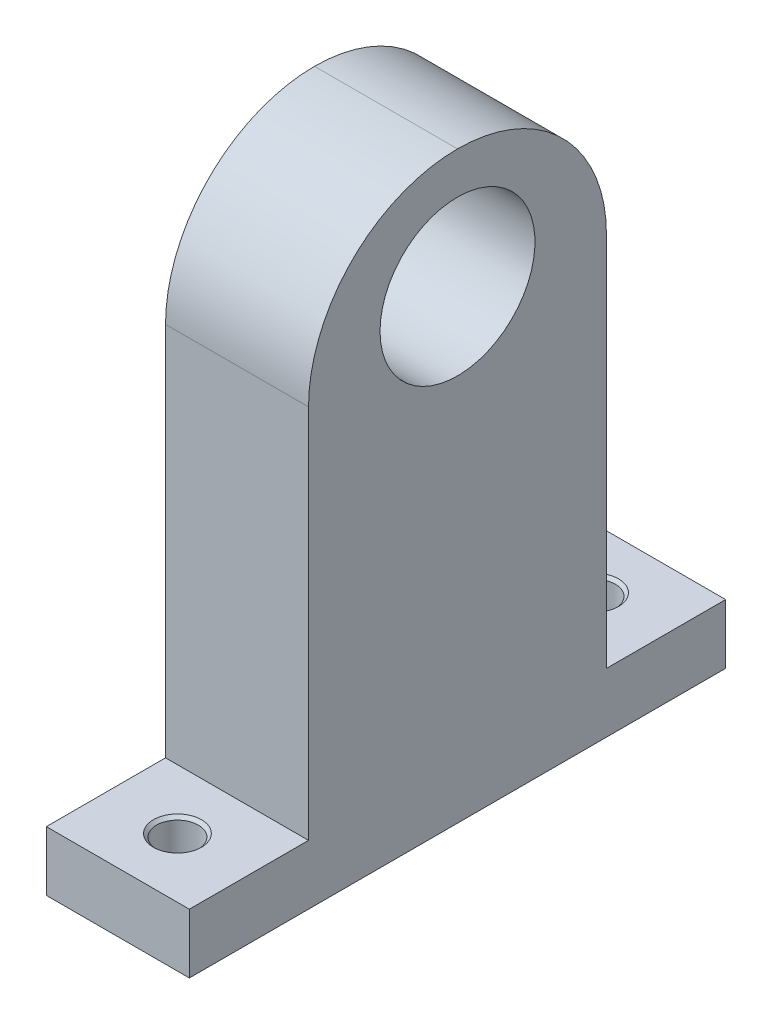
ISO-10303-21;
HEADER;
FILE_DESCRIPTION(('STEP AP214'),'2;1');
FILE_NAME('part.step','',(''),(''),'','','');
FILE_SCHEMA(('AUTOMOTIVE_DESIGN { 1 0 10303 214 1 1 1 1 }'));
ENDSEC;
DATA;
#1=APPLICATION_CONTEXT('core data for automotive mechanical design processes');
#2=APPLICATION_PROTOCOL_DEFINITION('international standard','automotive_design',2000,#1);
#3=PRODUCT_CONTEXT('',#1,'mechanical');
#4=PRODUCT('Part','Part','',(#3));
#5=PRODUCT_RELATED_PRODUCT_CATEGORY('part','',(#4));
#6=PRODUCT_DEFINITION_FORMATION('','',#4);
#7=PRODUCT_DEFINITION_CONTEXT('part definition',#1,'design');
#8=PRODUCT_DEFINITION('design','',#6,#7);
#9=PRODUCT_DEFINITION_SHAPE('','',#8);
#10=(LENGTH_UNIT() NAMED_UNIT(*) SI_UNIT(.MILLI.,.METRE.));
#11=(NAMED_UNIT(*) PLANE_ANGLE_UNIT() SI_UNIT($,.RADIAN.));
#12=(NAMED_UNIT(*) SI_UNIT($,.STERADIAN.) SOLID_ANGLE_UNIT());
#13=UNCERTAINTY_MEASURE_WITH_UNIT(LENGTH_MEASURE(1.E-05),#10,'distance_accuracy_value','');
#14=(GEOMETRIC_REPRESENTATION_CONTEXT(3) GLOBAL_UNCERTAINTY_ASSIGNED_CONTEXT((#13)) GLOBAL_UNIT_ASSIGNED_CONTEXT((#10,
#11,#12)) REPRESENTATION_CONTEXT('',''));
#15=CARTESIAN_POINT('',(0.,0.,0.));
#16=DIRECTION('',(0.,0.,1.));
#17=DIRECTION('',(1.,0.,0.));
#18=AXIS2_PLACEMENT_3D('',#15,#16,#17);
#19=CARTESIAN_POINT('',(0.,10.,0.));
#20=DIRECTION('',(0.,1.,0.));
#21=DIRECTION('',(0.,0.,1.));
#22=AXIS2_PLACEMENT_3D('',#19,#20,#21);
#23=PLANE('',#22);
#24=CARTESIAN_POINT('',(0.,10.,-35.));
#25=DIRECTION('',(0.,1.,0.));
#26=DIRECTION('',(0.,0.,1.));
#27=AXIS2_PLACEMENT_3D('',#24,#25,#26);
#28=CIRCLE('',#27,4.025);
#29=CARTESIAN_POINT('',(0.,10.,-30.975));
#30=VERTEX_POINT('',#29);
#31=EDGE_CURVE('E261',#30,#30,#28,.T.);
#32=ORIENTED_EDGE('',*,*,#31,.F.);
#33=EDGE_LOOP('',(#32));
#34=FACE_BOUND('',#33,.T.);
#35=DIRECTION('',(-1.,0.,0.));
#36=VECTOR('',#35,1.);
#37=CARTESIAN_POINT('',(-4.,10.,-25.));
#38=LINE('',#37,#36);
#39=CARTESIAN_POINT('',(11.9999999999999,10.,-25.));
#40=VERTEX_POINT('',#39);
#41=CARTESIAN_POINT('',(-12.,10.,-25.));
#42=VERTEX_POINT('',#41);
#43=EDGE_CURVE('E167',#40,#42,#38,.T.);
#44=ORIENTED_EDGE('',*,*,#43,.F.);
#45=DIRECTION('',(0.,0.,-1.));
#46=VECTOR('',#45,1.);
#47=CARTESIAN_POINT('',(12.,10.,37.5));
#48=LINE('',#47,#46);
#49=CARTESIAN_POINT('',(12.,10.,-45.));
#50=VERTEX_POINT('',#49);
#51=EDGE_CURVE('E125',#40,#50,#48,.T.);
#52=ORIENTED_EDGE('',*,*,#51,.T.);
#53=DIRECTION('',(1.,0.,0.));
#54=VECTOR('',#53,1.);
#55=CARTESIAN_POINT('',(-12.,10.,-45.));
#56=LINE('',#55,#54);
#57=CARTESIAN_POINT('',(-12.,10.,-45.));
#58=VERTEX_POINT('',#57);
#59=EDGE_CURVE('E151',#58,#50,#56,.T.);
#60=ORIENTED_EDGE('',*,*,#59,.F.);
#61=DIRECTION('',(0.,0.,1.));
#62=VECTOR('',#61,1.);
#63=CARTESIAN_POINT('',(-12.,10.,-40.));
#64=LINE('',#63,#62);
#65=EDGE_CURVE('E178',#58,#42,#64,.T.);
#66=ORIENTED_EDGE('',*,*,#65,.T.);
#67=EDGE_LOOP('',(#44,#52,#60,#66));
#68=FACE_BOUND('',#67,.T.);
#69=ADVANCED_FACE('F47',(#34,#68),#23,.T.);
#70=CARTESIAN_POINT('',(-12.,10.,37.5));
#71=DIRECTION('',(1.,0.,0.));
#72=DIRECTION('',(0.,0.,-1.));
#73=AXIS2_PLACEMENT_3D('',#70,#71,#72);
#74=PLANE('',#73);
#75=CARTESIAN_POINT('',(-12.,78.,0.));
#76=DIRECTION('',(-1.,0.,0.));
#77=DIRECTION('',(0.,0.,1.));
#78=AXIS2_PLACEMENT_3D('',#75,#76,#77);
#79=CIRCLE('',#78,13.);
#80=CARTESIAN_POINT('',(-12.,78.,13.));
#81=VERTEX_POINT('',#80);
#82=EDGE_CURVE('E163',#81,#81,#79,.T.);
#83=ORIENTED_EDGE('',*,*,#82,.F.);
#84=EDGE_LOOP('',(#83));
#85=FACE_BOUND('',#84,.T.);
#86=CARTESIAN_POINT('',(-12.,73.,0.));
#87=DIRECTION('',(1.,0.,0.));
#88=DIRECTION('',(0.,0.,-1.));
#89=AXIS2_PLACEMENT_3D('',#86,#87,#88);
#90=CIRCLE('',#89,25.);
#91=CARTESIAN_POINT('',(-12.,73.,25.));
#92=VERTEX_POINT('',#91);
#93=CARTESIAN_POINT('',(-12.,98.,0.));
#94=VERTEX_POINT('',#93);
#95=EDGE_CURVE('E124',#92,#94,#90,.F.);
#96=ORIENTED_EDGE('',*,*,#95,.T.);
#97=CARTESIAN_POINT('',(-12.,73.,0.));
#98=DIRECTION('',(1.,0.,0.));
#99=DIRECTION('',(0.,0.,-1.));
#100=AXIS2_PLACEMENT_3D('',#97,#98,#99);
#101=CIRCLE('',#100,25.);
#102=CARTESIAN_POINT('',(-12.,73.,-25.));
#103=VERTEX_POINT('',#102);
#104=EDGE_CURVE('E185',#94,#103,#101,.F.);
#105=ORIENTED_EDGE('',*,*,#104,.T.);
#106=DIRECTION('',(0.,-1.,0.));
#107=VECTOR('',#106,1.);
#108=CARTESIAN_POINT('',(-12.,78.,-25.));
#109=LINE('',#108,#107);
#110=EDGE_CURVE('E170',#103,#42,#109,.T.);
#111=ORIENTED_EDGE('',*,*,#110,.T.);
#112=ORIENTED_EDGE('',*,*,#65,.F.);
#113=DIRECTION('',(0.,-1.,0.));
#114=VECTOR('',#113,1.);
#115=CARTESIAN_POINT('',(-12.,10.,-45.));
#116=LINE('',#115,#114);
#117=CARTESIAN_POINT('',(-12.,0.,-45.));
#118=VERTEX_POINT('',#117);
#119=EDGE_CURVE('E148',#58,#118,#116,.T.);
#120=ORIENTED_EDGE('',*,*,#119,.T.);
#121=DIRECTION('',(0.,0.,1.));
#122=VECTOR('',#121,1.);
#123=CARTESIAN_POINT('',(-12.,0.,37.5));
#124=LINE('',#123,#122);
#125=CARTESIAN_POINT('',(-12.,0.,45.));
#126=VERTEX_POINT('',#125);
#127=EDGE_CURVE('E177',#118,#126,#124,.T.);
#128=ORIENTED_EDGE('',*,*,#127,.T.);
#129=DIRECTION('',(0.,-1.,0.));
#130=VECTOR('',#129,1.);
#131=CARTESIAN_POINT('',(-12.,10.,45.));
#132=LINE('',#131,#130);
#133=CARTESIAN_POINT('',(-12.,10.,45.));
#134=VERTEX_POINT('',#133);
#135=EDGE_CURVE('E134',#134,#126,#132,.T.);
#136=ORIENTED_EDGE('',*,*,#135,.F.);
#137=CARTESIAN_POINT('',(-12.,10.,25.));
#138=VERTEX_POINT('',#137);
#139=EDGE_CURVE('E138',#138,#134,#64,.T.);
#140=ORIENTED_EDGE('',*,*,#139,.F.);
#141=DIRECTION('',(0.,-1.,0.));
#142=VECTOR('',#141,1.);
#143=CARTESIAN_POINT('',(-12.,78.,25.));
#144=LINE('',#143,#142);
#145=EDGE_CURVE('E175',#92,#138,#144,.T.);
#146=ORIENTED_EDGE('',*,*,#145,.F.);
#147=EDGE_LOOP('',(#96,#105,#111,#112,#120,#128,#136,#140,#146));
#148=FACE_BOUND('',#147,.T.);
#149=ADVANCED_FACE('F204',(#85,#148),#74,.F.);
#150=CARTESIAN_POINT('',(12.,10.,-37.5));
#151=DIRECTION('',(-1.,0.,0.));
#152=DIRECTION('',(0.,0.,1.));
#153=AXIS2_PLACEMENT_3D('',#150,#151,#152);
#154=PLANE('',#153);
#155=CARTESIAN_POINT('',(12.,78.,0.));
#156=DIRECTION('',(-1.,0.,0.));
#157=DIRECTION('',(0.,0.,1.));
#158=AXIS2_PLACEMENT_3D('',#155,#156,#157);
#159=CIRCLE('',#158,13.);
#160=CARTESIAN_POINT('',(12.,78.,13.));
#161=VERTEX_POINT('',#160);
#162=EDGE_CURVE('E159',#161,#161,#159,.T.);
#163=ORIENTED_EDGE('',*,*,#162,.T.);
#164=EDGE_LOOP('',(#163));
#165=FACE_BOUND('',#164,.T.);
#166=DIRECTION('',(0.,-1.,0.));
#167=VECTOR('',#166,1.);
#168=CARTESIAN_POINT('',(12.,78.,-25.));
#169=LINE('',#168,#167);
#170=CARTESIAN_POINT('',(12.,73.,-25.));
#171=VERTEX_POINT('',#170);
#172=EDGE_CURVE('E172',#171,#40,#169,.T.);
#173=ORIENTED_EDGE('',*,*,#172,.F.);
#174=CARTESIAN_POINT('',(12.,73.,0.));
#175=DIRECTION('',(-1.,0.,0.));
#176=DIRECTION('',(0.,0.,1.));
#177=AXIS2_PLACEMENT_3D('',#174,#175,#176);
#178=CIRCLE('',#177,25.);
#179=CARTESIAN_POINT('',(12.,98.,0.));
#180=VERTEX_POINT('',#179);
#181=EDGE_CURVE('E56',#171,#180,#178,.F.);
#182=ORIENTED_EDGE('',*,*,#181,.T.);
#183=CARTESIAN_POINT('',(12.,73.,0.));
#184=DIRECTION('',(-1.,0.,0.));
#185=DIRECTION('',(0.,0.,1.));
#186=AXIS2_PLACEMENT_3D('',#183,#184,#185);
#187=CIRCLE('',#186,25.);
#188=CARTESIAN_POINT('',(12.,73.,25.));
#189=VERTEX_POINT('',#188);
#190=EDGE_CURVE('E63',#180,#189,#187,.F.);
#191=ORIENTED_EDGE('',*,*,#190,.T.);
#192=DIRECTION('',(0.,-1.,0.));
#193=VECTOR('',#192,1.);
#194=CARTESIAN_POINT('',(12.,78.,25.));
#195=LINE('',#194,#193);
#196=CARTESIAN_POINT('',(12.,10.,25.));
#197=VERTEX_POINT('',#196);
#198=EDGE_CURVE('E119',#189,#197,#195,.T.);
#199=ORIENTED_EDGE('',*,*,#198,.T.);
#200=CARTESIAN_POINT('',(12.,10.,45.));
#201=VERTEX_POINT('',#200);
#202=EDGE_CURVE('E114',#201,#197,#48,.T.);
#203=ORIENTED_EDGE('',*,*,#202,.F.);
#204=DIRECTION('',(0.,-1.,0.));
#205=VECTOR('',#204,1.);
#206=CARTESIAN_POINT('',(12.,10.,45.));
#207=LINE('',#206,#205);
#208=CARTESIAN_POINT('',(12.,0.,45.));
#209=VERTEX_POINT('',#208);
#210=EDGE_CURVE('E117',#201,#209,#207,.T.);
#211=ORIENTED_EDGE('',*,*,#210,.T.);
#212=DIRECTION('',(0.,0.,-1.));
#213=VECTOR('',#212,1.);
#214=CARTESIAN_POINT('',(12.,0.,-37.5));
#215=LINE('',#214,#213);
#216=CARTESIAN_POINT('',(12.,0.,-45.));
#217=VERTEX_POINT('',#216);
#218=EDGE_CURVE('E182',#209,#217,#215,.T.);
#219=ORIENTED_EDGE('',*,*,#218,.T.);
#220=DIRECTION('',(0.,-1.,0.));
#221=VECTOR('',#220,1.);
#222=CARTESIAN_POINT('',(12.,10.,-45.));
#223=LINE('',#222,#221);
#224=EDGE_CURVE('E152',#50,#217,#223,.T.);
#225=ORIENTED_EDGE('',*,*,#224,.F.);
#226=ORIENTED_EDGE('',*,*,#51,.F.);
#227=EDGE_LOOP('',(#173,#182,#191,#199,#203,#211,#219,#225,#226));
#228=FACE_BOUND('',#227,.T.);
#229=ADVANCED_FACE('F116',(#165,#228),#154,.F.);
#230=CARTESIAN_POINT('',(0.,10.,35.));
#231=DIRECTION('',(0.,1.,0.));
#232=DIRECTION('',(0.,0.,1.));
#233=AXIS2_PLACEMENT_3D('',#230,#231,#232);
#234=CIRCLE('',#233,4.025);
#235=CARTESIAN_POINT('',(0.,10.,39.025));
#236=VERTEX_POINT('',#235);
#237=EDGE_CURVE('E249',#236,#236,#234,.T.);
#238=ORIENTED_EDGE('',*,*,#237,.F.);
#239=EDGE_LOOP('',(#238));
#240=FACE_BOUND('',#239,.T.);
#241=DIRECTION('',(1.,0.,0.));
#242=VECTOR('',#241,1.);
#243=CARTESIAN_POINT('',(12.,10.,25.));
#244=LINE('',#243,#242);
#245=EDGE_CURVE('E162',#138,#197,#244,.T.);
#246=ORIENTED_EDGE('',*,*,#245,.F.);
#247=ORIENTED_EDGE('',*,*,#139,.T.);
#248=DIRECTION('',(-1.,0.,0.));
#249=VECTOR('',#248,1.);
#250=CARTESIAN_POINT('',(-12.,10.,45.));
#251=LINE('',#250,#249);
#252=EDGE_CURVE('E131',#201,#134,#251,.T.);
#253=ORIENTED_EDGE('',*,*,#252,.F.);
#254=ORIENTED_EDGE('',*,*,#202,.T.);
#255=EDGE_LOOP('',(#246,#247,#253,#254));
#256=FACE_BOUND('',#255,.T.);
#257=ADVANCED_FACE('F136',(#240,#256),#23,.T.);
#258=CARTESIAN_POINT('',(0.,0.,0.));
#259=DIRECTION('',(0.,1.,0.));
#260=DIRECTION('',(0.,0.,1.));
#261=AXIS2_PLACEMENT_3D('',#258,#259,#260);
#262=PLANE('',#261);
#263=CARTESIAN_POINT('',(0.,0.,-35.));
#264=DIRECTION('',(0.,1.,0.));
#265=DIRECTION('',(0.,0.,1.));
#266=AXIS2_PLACEMENT_3D('',#263,#264,#265);
#267=CIRCLE('',#266,3.5);
#268=CARTESIAN_POINT('',(0.,0.,-31.5));
#269=VERTEX_POINT('',#268);
#270=EDGE_CURVE('E252',#269,#269,#267,.T.);
#271=ORIENTED_EDGE('',*,*,#270,.T.);
#272=EDGE_LOOP('',(#271));
#273=FACE_BOUND('',#272,.T.);
#274=CARTESIAN_POINT('',(0.,0.,35.));
#275=DIRECTION('',(0.,1.,0.));
#276=DIRECTION('',(0.,0.,1.));
#277=AXIS2_PLACEMENT_3D('',#274,#275,#276);
#278=CIRCLE('',#277,3.5);
#279=CARTESIAN_POINT('',(0.,0.,38.5));
#280=VERTEX_POINT('',#279);
#281=EDGE_CURVE('E144',#280,#280,#278,.T.);
#282=ORIENTED_EDGE('',*,*,#281,.T.);
#283=EDGE_LOOP('',(#282));
#284=FACE_BOUND('',#283,.T.);
#285=ORIENTED_EDGE('',*,*,#127,.F.);
#286=DIRECTION('',(1.,0.,0.));
#287=VECTOR('',#286,1.);
#288=CARTESIAN_POINT('',(-12.,0.,-45.));
#289=LINE('',#288,#287);
#290=EDGE_CURVE('E141',#118,#217,#289,.T.);
#291=ORIENTED_EDGE('',*,*,#290,.T.);
#292=ORIENTED_EDGE('',*,*,#218,.F.);
#293=DIRECTION('',(-1.,0.,0.));
#294=VECTOR('',#293,1.);
#295=CARTESIAN_POINT('',(-12.,0.,45.));
#296=LINE('',#295,#294);
#297=EDGE_CURVE('E133',#209,#126,#296,.T.);
#298=ORIENTED_EDGE('',*,*,#297,.T.);
#299=EDGE_LOOP('',(#285,#291,#292,#298));
#300=FACE_BOUND('',#299,.T.);
#301=ADVANCED_FACE('F209',(#273,#284,#300),#262,.F.);
#302=CARTESIAN_POINT('',(12.,78.,25.));
#303=DIRECTION('',(0.,0.,-1.));
#304=DIRECTION('',(-1.,0.,0.));
#305=AXIS2_PLACEMENT_3D('',#302,#303,#304);
#306=PLANE('',#305);
#307=ORIENTED_EDGE('',*,*,#198,.F.);
#308=DIRECTION('',(1.,0.,0.));
#309=VECTOR('',#308,1.);
#310=CARTESIAN_POINT('',(12.,73.,25.));
#311=LINE('',#310,#309);
#312=EDGE_CURVE('E11',#189,#92,#311,.F.);
#313=ORIENTED_EDGE('',*,*,#312,.T.);
#314=ORIENTED_EDGE('',*,*,#145,.T.);
#315=ORIENTED_EDGE('',*,*,#245,.T.);
#316=EDGE_LOOP('',(#307,#313,#314,#315));
#317=FACE_BOUND('',#316,.T.);
#318=ADVANCED_FACE('F243',(#317),#306,.F.);
#319=CARTESIAN_POINT('',(-4.,78.,-25.));
#320=DIRECTION('',(0.,0.,1.));
#321=DIRECTION('',(1.,0.,0.));
#322=AXIS2_PLACEMENT_3D('',#319,#320,#321);
#323=PLANE('',#322);
#324=ORIENTED_EDGE('',*,*,#110,.F.);
#325=DIRECTION('',(-1.,0.,0.));
#326=VECTOR('',#325,1.);
#327=CARTESIAN_POINT('',(-4.,73.,-25.));
#328=LINE('',#327,#326);
#329=EDGE_CURVE('E187',#103,#171,#328,.F.);
#330=ORIENTED_EDGE('',*,*,#329,.T.);
#331=ORIENTED_EDGE('',*,*,#172,.T.);
#332=ORIENTED_EDGE('',*,*,#43,.T.);
#333=EDGE_LOOP('',(#324,#330,#331,#332));
#334=FACE_BOUND('',#333,.T.);
#335=ADVANCED_FACE('F194',(#334),#323,.F.);
#336=CARTESIAN_POINT('',(12.,78.,0.));
#337=DIRECTION('',(-1.,0.,0.));
#338=DIRECTION('',(0.,0.,1.));
#339=AXIS2_PLACEMENT_3D('',#336,#337,#338);
#340=CYLINDRICAL_SURFACE('',#339,13.);
#341=ORIENTED_EDGE('',*,*,#162,.F.);
#342=EDGE_LOOP('',(#341));
#343=FACE_BOUND('',#342,.T.);
#344=ORIENTED_EDGE('',*,*,#82,.T.);
#345=EDGE_LOOP('',(#344));
#346=FACE_BOUND('',#345,.T.);
#347=ADVANCED_FACE('F224',(#343,#346),#340,.F.);
#348=CARTESIAN_POINT('',(0.,73.,0.));
#349=DIRECTION('',(1.,0.,0.));
#350=DIRECTION('',(0.,0.,-1.));
#351=AXIS2_PLACEMENT_3D('',#348,#349,#350);
#352=CYLINDRICAL_SURFACE('',#351,25.);
#353=ORIENTED_EDGE('',*,*,#312,.F.);
#354=ORIENTED_EDGE('',*,*,#190,.F.);
#355=DIRECTION('',(1.,0.,0.));
#356=VECTOR('',#355,1.);
#357=CARTESIAN_POINT('',(0.,98.,0.));
#358=LINE('',#357,#356);
#359=EDGE_CURVE('E51',#94,#180,#358,.T.);
#360=ORIENTED_EDGE('',*,*,#359,.F.);
#361=ORIENTED_EDGE('',*,*,#95,.F.);
#362=EDGE_LOOP('',(#353,#354,#360,#361));
#363=FACE_BOUND('',#362,.T.);
#364=ADVANCED_FACE('F49',(#363),#352,.T.);
#365=CARTESIAN_POINT('',(0.,73.,0.));
#366=DIRECTION('',(-1.,0.,0.));
#367=DIRECTION('',(0.,0.,1.));
#368=AXIS2_PLACEMENT_3D('',#365,#366,#367);
#369=CYLINDRICAL_SURFACE('',#368,25.);
#370=ORIENTED_EDGE('',*,*,#181,.F.);
#371=ORIENTED_EDGE('',*,*,#329,.F.);
#372=ORIENTED_EDGE('',*,*,#104,.F.);
#373=ORIENTED_EDGE('',*,*,#359,.T.);
#374=EDGE_LOOP('',(#370,#371,#372,#373));
#375=FACE_BOUND('',#374,.T.);
#376=ADVANCED_FACE('F217',(#375),#369,.T.);
#377=CARTESIAN_POINT('',(-12.,10.,-45.));
#378=DIRECTION('',(0.,0.,-1.));
#379=DIRECTION('',(-1.,0.,0.));
#380=AXIS2_PLACEMENT_3D('',#377,#378,#379);
#381=PLANE('',#380);
#382=ORIENTED_EDGE('',*,*,#290,.F.);
#383=ORIENTED_EDGE('',*,*,#119,.F.);
#384=ORIENTED_EDGE('',*,*,#59,.T.);
#385=ORIENTED_EDGE('',*,*,#224,.T.);
#386=EDGE_LOOP('',(#382,#383,#384,#385));
#387=FACE_BOUND('',#386,.T.);
#388=ADVANCED_FACE('F207',(#387),#381,.T.);
#389=CARTESIAN_POINT('',(-12.,10.,45.));
#390=DIRECTION('',(0.,0.,1.));
#391=DIRECTION('',(1.,0.,0.));
#392=AXIS2_PLACEMENT_3D('',#389,#390,#391);
#393=PLANE('',#392);
#394=ORIENTED_EDGE('',*,*,#297,.F.);
#395=ORIENTED_EDGE('',*,*,#210,.F.);
#396=ORIENTED_EDGE('',*,*,#252,.T.);
#397=ORIENTED_EDGE('',*,*,#135,.T.);
#398=EDGE_LOOP('',(#394,#395,#396,#397));
#399=FACE_BOUND('',#398,.T.);
#400=ADVANCED_FACE('F129',(#399),#393,.T.);
#401=CARTESIAN_POINT('',(0.,10.,35.));
#402=DIRECTION('',(0.,1.,0.));
#403=DIRECTION('',(0.,0.,1.));
#404=AXIS2_PLACEMENT_3D('',#401,#402,#403);
#405=CYLINDRICAL_SURFACE('',#404,3.5);
#406=ORIENTED_EDGE('',*,*,#281,.F.);
#407=EDGE_LOOP('',(#406));
#408=FACE_BOUND('',#407,.T.);
#409=CARTESIAN_POINT('',(0.,9.475,35.));
#410=DIRECTION('',(0.,1.,0.));
#411=DIRECTION('',(0.,0.,1.));
#412=AXIS2_PLACEMENT_3D('',#409,#410,#411);
#413=CIRCLE('',#412,3.5);
#414=CARTESIAN_POINT('',(0.,9.475,38.5));
#415=VERTEX_POINT('',#414);
#416=EDGE_CURVE('E251',#415,#415,#413,.T.);
#417=ORIENTED_EDGE('',*,*,#416,.T.);
#418=EDGE_LOOP('',(#417));
#419=FACE_BOUND('',#418,.T.);
#420=ADVANCED_FACE('F281',(#408,#419),#405,.F.);
#421=CARTESIAN_POINT('',(0.,10.,35.));
#422=DIRECTION('',(0.,1.,0.));
#423=DIRECTION('',(0.,0.,1.));
#424=AXIS2_PLACEMENT_3D('',#421,#422,#423);
#425=CONICAL_SURFACE('',#424,4.025,0.785398163397445);
#426=ORIENTED_EDGE('',*,*,#416,.F.);
#427=EDGE_LOOP('',(#426));
#428=FACE_BOUND('',#427,.T.);
#429=ORIENTED_EDGE('',*,*,#237,.T.);
#430=EDGE_LOOP('',(#429));
#431=FACE_BOUND('',#430,.T.);
#432=ADVANCED_FACE('F274',(#428,#431),#425,.F.);
#433=CARTESIAN_POINT('',(0.,10.,-35.));
#434=DIRECTION('',(0.,1.,0.));
#435=DIRECTION('',(0.,0.,1.));
#436=AXIS2_PLACEMENT_3D('',#433,#434,#435);
#437=CYLINDRICAL_SURFACE('',#436,3.5);
#438=ORIENTED_EDGE('',*,*,#270,.F.);
#439=EDGE_LOOP('',(#438));
#440=FACE_BOUND('',#439,.T.);
#441=CARTESIAN_POINT('',(0.,9.475,-35.));
#442=DIRECTION('',(0.,1.,0.));
#443=DIRECTION('',(0.,0.,1.));
#444=AXIS2_PLACEMENT_3D('',#441,#442,#443);
#445=CIRCLE('',#444,3.5);
#446=CARTESIAN_POINT('',(0.,9.475,-31.5));
#447=VERTEX_POINT('',#446);
#448=EDGE_CURVE('E256',#447,#447,#445,.T.);
#449=ORIENTED_EDGE('',*,*,#448,.T.);
#450=EDGE_LOOP('',(#449));
#451=FACE_BOUND('',#450,.T.);
#452=ADVANCED_FACE('F266',(#440,#451),#437,.F.);
#453=CARTESIAN_POINT('',(0.,10.,-35.));
#454=DIRECTION('',(0.,1.,0.));
#455=DIRECTION('',(0.,0.,1.));
#456=AXIS2_PLACEMENT_3D('',#453,#454,#455);
#457=CONICAL_SURFACE('',#456,4.025,0.785398163397445);
#458=ORIENTED_EDGE('',*,*,#448,.F.);
#459=EDGE_LOOP('',(#458));
#460=FACE_BOUND('',#459,.T.);
#461=ORIENTED_EDGE('',*,*,#31,.T.);
#462=EDGE_LOOP('',(#461));
#463=FACE_BOUND('',#462,.T.);
#464=ADVANCED_FACE('F264',(#460,#463),#457,.F.);
#465=CLOSED_SHELL('',(#69,#149,#229,#257,#301,#318,#335,#347,#364,#376,#388,#400,#420,#432,#452,#464));
#466=MANIFOLD_SOLID_BREP('B2',#465);
#467=ADVANCED_BREP_SHAPE_REPRESENTATION('',(#18,#466),#14);
#468=SHAPE_DEFINITION_REPRESENTATION(#9,#467);
ENDSEC;
END-ISO-10303-21;
